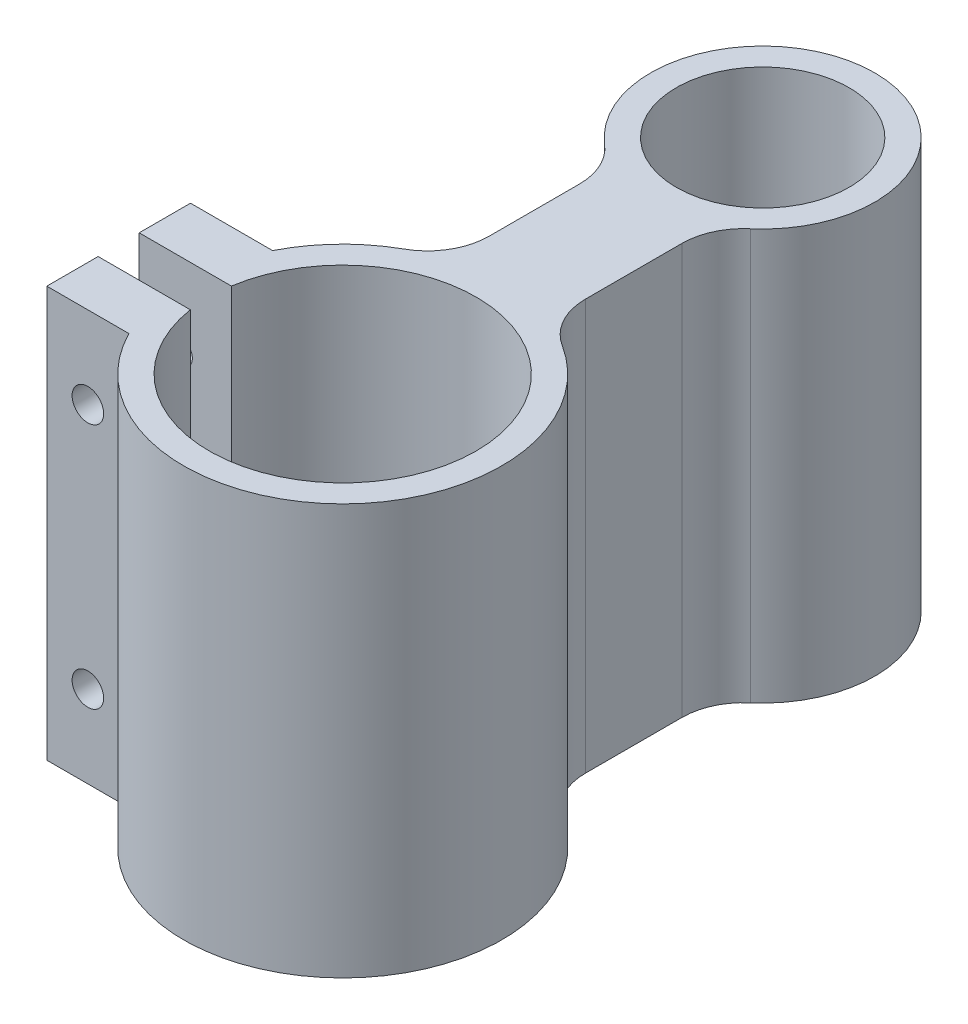
ISO-10303-21;
HEADER;
FILE_DESCRIPTION(('STEP AP214'),'2;1');
FILE_NAME('part.step','',(''),(''),'','','');
FILE_SCHEMA(('AUTOMOTIVE_DESIGN { 1 0 10303 214 1 1 1 1 }'));
ENDSEC;
DATA;
#1=APPLICATION_CONTEXT('core data for automotive mechanical design processes');
#2=APPLICATION_PROTOCOL_DEFINITION('international standard','automotive_design',2000,#1);
#3=PRODUCT_CONTEXT('',#1,'mechanical');
#4=PRODUCT('Part','Part','',(#3));
#5=PRODUCT_RELATED_PRODUCT_CATEGORY('part','',(#4));
#6=PRODUCT_DEFINITION_FORMATION('','',#4);
#7=PRODUCT_DEFINITION_CONTEXT('part definition',#1,'design');
#8=PRODUCT_DEFINITION('design','',#6,#7);
#9=PRODUCT_DEFINITION_SHAPE('','',#8);
#10=(LENGTH_UNIT() NAMED_UNIT(*) SI_UNIT(.MILLI.,.METRE.));
#11=(NAMED_UNIT(*) PLANE_ANGLE_UNIT() SI_UNIT($,.RADIAN.));
#12=(NAMED_UNIT(*) SI_UNIT($,.STERADIAN.) SOLID_ANGLE_UNIT());
#13=UNCERTAINTY_MEASURE_WITH_UNIT(LENGTH_MEASURE(1.E-05),#10,'distance_accuracy_value','');
#14=(GEOMETRIC_REPRESENTATION_CONTEXT(3) GLOBAL_UNCERTAINTY_ASSIGNED_CONTEXT((#13)) GLOBAL_UNIT_ASSIGNED_CONTEXT((#10,
#11,#12)) REPRESENTATION_CONTEXT('',''));
#15=CARTESIAN_POINT('',(0.,0.,0.));
#16=DIRECTION('',(0.,0.,1.));
#17=DIRECTION('',(1.,0.,0.));
#18=AXIS2_PLACEMENT_3D('',#15,#16,#17);
#19=CARTESIAN_POINT('',(0.787192232949083,50.8,-32.7963390410233));
#20=DIRECTION('',(0.,-1.,0.));
#21=DIRECTION('',(0.,0.,-1.));
#22=AXIS2_PLACEMENT_3D('',#19,#20,#21);
#23=CYLINDRICAL_SURFACE('',#22,10.6934);
#24=CARTESIAN_POINT('',(0.787192232949083,50.8,-32.7963390410233));
#25=DIRECTION('',(0.,1.,0.));
#26=DIRECTION('',(0.,0.,1.));
#27=AXIS2_PLACEMENT_3D('',#24,#25,#26);
#28=CIRCLE('',#27,10.6934);
#29=CARTESIAN_POINT('',(0.787192232949083,50.8,-22.1029390410233));
#30=VERTEX_POINT('',#29);
#31=EDGE_CURVE('E397',#30,#30,#28,.T.);
#32=ORIENTED_EDGE('',*,*,#31,.T.);
#33=EDGE_LOOP('',(#32));
#34=FACE_BOUND('',#33,.T.);
#35=CARTESIAN_POINT('',(0.787192232949083,0.,-32.7963390410233));
#36=DIRECTION('',(0.,1.,0.));
#37=DIRECTION('',(0.,0.,1.));
#38=AXIS2_PLACEMENT_3D('',#35,#36,#37);
#39=CIRCLE('',#38,10.6934);
#40=CARTESIAN_POINT('',(0.787192232949083,0.,-22.1029390410233));
#41=VERTEX_POINT('',#40);
#42=EDGE_CURVE('E308',#41,#41,#39,.T.);
#43=ORIENTED_EDGE('',*,*,#42,.F.);
#44=EDGE_LOOP('',(#43));
#45=FACE_BOUND('',#44,.T.);
#46=ADVANCED_FACE('F172',(#34,#45),#23,.F.);
#47=CARTESIAN_POINT('',(0.787192232949083,50.8,-32.7963390410233));
#48=DIRECTION('',(0.,-1.,0.));
#49=DIRECTION('',(0.,0.,-1.));
#50=AXIS2_PLACEMENT_3D('',#47,#48,#49);
#51=CYLINDRICAL_SURFACE('',#50,13.8684);
#52=CARTESIAN_POINT('',(0.787192232949083,50.8,-32.7963390410233));
#53=DIRECTION('',(0.,1.,0.));
#54=DIRECTION('',(0.,0.,1.));
#55=AXIS2_PLACEMENT_3D('',#52,#53,#54);
#56=CIRCLE('',#55,13.8684);
#57=CARTESIAN_POINT('',(9.80329152372923,50.8,-22.258669842439));
#58=VERTEX_POINT('',#57);
#59=CARTESIAN_POINT('',(-8.22890705783106,50.8,-22.258669842439));
#60=VERTEX_POINT('',#59);
#61=EDGE_CURVE('E358',#58,#60,#56,.T.);
#62=ORIENTED_EDGE('',*,*,#61,.F.);
#63=DIRECTION('',(0.,-1.,0.));
#64=VECTOR('',#63,1.);
#65=CARTESIAN_POINT('',(9.80329152372923,50.8,-22.258669842439));
#66=LINE('',#65,#64);
#67=CARTESIAN_POINT('',(9.80329152372923,0.,-22.258669842439));
#68=VERTEX_POINT('',#67);
#69=EDGE_CURVE('E365',#58,#68,#66,.T.);
#70=ORIENTED_EDGE('',*,*,#69,.T.);
#71=CARTESIAN_POINT('',(0.787192232949083,0.,-32.7963390410233));
#72=DIRECTION('',(0.,1.,0.));
#73=DIRECTION('',(0.,0.,1.));
#74=AXIS2_PLACEMENT_3D('',#71,#72,#73);
#75=CIRCLE('',#74,13.8684);
#76=CARTESIAN_POINT('',(-8.22890705783106,0.,-22.258669842439));
#77=VERTEX_POINT('',#76);
#78=EDGE_CURVE('E389',#68,#77,#75,.T.);
#79=ORIENTED_EDGE('',*,*,#78,.T.);
#80=DIRECTION('',(0.,-1.,0.));
#81=VECTOR('',#80,1.);
#82=CARTESIAN_POINT('',(-8.22890705783106,50.8,-22.258669842439));
#83=LINE('',#82,#81);
#84=EDGE_CURVE('E363',#77,#60,#83,.F.);
#85=ORIENTED_EDGE('',*,*,#84,.T.);
#86=EDGE_LOOP('',(#62,#70,#79,#85));
#87=FACE_BOUND('',#86,.T.);
#88=ADVANCED_FACE('F395',(#87),#51,.T.);
#89=CARTESIAN_POINT('',(0.,50.8,0.));
#90=DIRECTION('',(0.,1.,0.));
#91=DIRECTION('',(0.,0.,1.));
#92=AXIS2_PLACEMENT_3D('',#89,#90,#91);
#93=PLANE('',#92);
#94=ORIENTED_EDGE('',*,*,#31,.F.);
#95=EDGE_LOOP('',(#94));
#96=FACE_BOUND('',#95,.T.);
#97=DIRECTION('',(0.,0.,1.));
#98=VECTOR('',#97,1.);
#99=CARTESIAN_POINT('',(7.13719223294909,50.8,-20.46710473552));
#100=LINE('',#99,#98);
#101=CARTESIAN_POINT('',(7.13719223294909,50.8,-16.4687417113487));
#102=VERTEX_POINT('',#101);
#103=CARTESIAN_POINT('',(7.13719223294909,50.8,-4.53910448693543));
#104=VERTEX_POINT('',#103);
#105=EDGE_CURVE('E345',#102,#104,#100,.T.);
#106=ORIENTED_EDGE('',*,*,#105,.F.);
#107=CARTESIAN_POINT('',(14.7571922329491,50.8,-16.4687417113487));
#108=DIRECTION('',(0.,1.,0.));
#109=DIRECTION('',(0.,0.,1.));
#110=AXIS2_PLACEMENT_3D('',#107,#108,#109);
#111=CIRCLE('',#110,7.62);
#112=EDGE_CURVE('E380',#102,#58,#111,.F.);
#113=ORIENTED_EDGE('',*,*,#112,.T.);
#114=ORIENTED_EDGE('',*,*,#61,.T.);
#115=CARTESIAN_POINT('',(-13.1828077670509,50.8,-16.4687417113486));
#116=DIRECTION('',(0.,1.,0.));
#117=DIRECTION('',(0.,0.,1.));
#118=AXIS2_PLACEMENT_3D('',#115,#116,#117);
#119=CIRCLE('',#118,7.62);
#120=CARTESIAN_POINT('',(-5.56280776705091,50.8,-16.4687417113486));
#121=VERTEX_POINT('',#120);
#122=EDGE_CURVE('E12',#60,#121,#119,.F.);
#123=ORIENTED_EDGE('',*,*,#122,.T.);
#124=DIRECTION('',(0.,0.,1.));
#125=VECTOR('',#124,1.);
#126=CARTESIAN_POINT('',(-5.56280776705091,50.8,-20.46710473552));
#127=LINE('',#126,#125);
#128=CARTESIAN_POINT('',(-5.56280776705091,50.8,-5.30139566395274));
#129=VERTEX_POINT('',#128);
#130=EDGE_CURVE('E339',#121,#129,#127,.T.);
#131=ORIENTED_EDGE('',*,*,#130,.T.);
#132=CARTESIAN_POINT('',(-13.1828077670509,50.8,-5.30139566395274));
#133=DIRECTION('',(0.,1.,0.));
#134=DIRECTION('',(0.,0.,1.));
#135=AXIS2_PLACEMENT_3D('',#132,#133,#134);
#136=CIRCLE('',#135,7.62);
#137=CARTESIAN_POINT('',(-9.46274019856852,50.8,1.34882969207283));
#138=VERTEX_POINT('',#137);
#139=EDGE_CURVE('E292',#129,#138,#136,.F.);
#140=ORIENTED_EDGE('',*,*,#139,.T.);
#141=CARTESIAN_POINT('',(0.147434353344346,50.8,18.5285785284722));
#142=DIRECTION('',(0.,1.,0.));
#143=DIRECTION('',(0.,0.,1.));
#144=AXIS2_PLACEMENT_3D('',#141,#142,#143);
#145=CIRCLE('',#144,19.685);
#146=CARTESIAN_POINT('',(-17.4157978377986,50.8,9.63857852847224));
#147=VERTEX_POINT('',#146);
#148=EDGE_CURVE('E283',#138,#147,#145,.T.);
#149=ORIENTED_EDGE('',*,*,#148,.T.);
#150=DIRECTION('',(-1.,0.,0.));
#151=VECTOR('',#150,1.);
#152=CARTESIAN_POINT('',(-17.4157978377986,50.8,9.63857852847224));
#153=LINE('',#152,#151);
#154=CARTESIAN_POINT('',(-27.5757978377986,50.8,9.63857852847224));
#155=VERTEX_POINT('',#154);
#156=EDGE_CURVE('E289',#147,#155,#153,.T.);
#157=ORIENTED_EDGE('',*,*,#156,.T.);
#158=DIRECTION('',(0.,0.,-1.));
#159=VECTOR('',#158,1.);
#160=CARTESIAN_POINT('',(-27.5757978377986,50.8,15.9885785284722));
#161=LINE('',#160,#159);
#162=CARTESIAN_POINT('',(-27.5757978377986,50.8,15.9885785284722));
#163=VERTEX_POINT('',#162);
#164=EDGE_CURVE('E314',#163,#155,#161,.T.);
#165=ORIENTED_EDGE('',*,*,#164,.F.);
#166=DIRECTION('',(-1.,0.,0.));
#167=VECTOR('',#166,1.);
#168=CARTESIAN_POINT('',(0.,50.8,15.9885785284722));
#169=LINE('',#168,#167);
#170=CARTESIAN_POINT('',(-16.1660110215604,50.8,15.9885785284722));
#171=VERTEX_POINT('',#170);
#172=EDGE_CURVE('E296',#171,#163,#169,.T.);
#173=ORIENTED_EDGE('',*,*,#172,.F.);
#174=CARTESIAN_POINT('',(0.147434353344346,50.8,18.5285785284722));
#175=DIRECTION('',(0.,1.,0.));
#176=DIRECTION('',(0.,0.,1.));
#177=AXIS2_PLACEMENT_3D('',#174,#175,#176);
#178=CIRCLE('',#177,16.51);
#179=CARTESIAN_POINT('',(-16.1660110215604,50.8,21.0685785284722));
#180=VERTEX_POINT('',#179);
#181=EDGE_CURVE('E428',#180,#171,#178,.T.);
#182=ORIENTED_EDGE('',*,*,#181,.F.);
#183=DIRECTION('',(-1.,0.,0.));
#184=VECTOR('',#183,1.);
#185=CARTESIAN_POINT('',(0.,50.8,21.0685785284722));
#186=LINE('',#185,#184);
#187=CARTESIAN_POINT('',(-27.5757978377986,50.8,21.0685785284722));
#188=VERTEX_POINT('',#187);
#189=EDGE_CURVE('E442',#180,#188,#186,.T.);
#190=ORIENTED_EDGE('',*,*,#189,.T.);
#191=DIRECTION('',(0.,0.,1.));
#192=VECTOR('',#191,1.);
#193=CARTESIAN_POINT('',(-27.5757978377986,50.8,21.0685785284722));
#194=LINE('',#193,#192);
#195=CARTESIAN_POINT('',(-27.5757978377986,50.8,27.4185785284722));
#196=VERTEX_POINT('',#195);
#197=EDGE_CURVE('E332',#188,#196,#194,.T.);
#198=ORIENTED_EDGE('',*,*,#197,.T.);
#199=DIRECTION('',(-1.,0.,0.));
#200=VECTOR('',#199,1.);
#201=CARTESIAN_POINT('',(-17.4157978377986,50.8,27.4185785284722));
#202=LINE('',#201,#200);
#203=CARTESIAN_POINT('',(-17.4157978377986,50.8,27.4185785284722));
#204=VERTEX_POINT('',#203);
#205=EDGE_CURVE('E329',#204,#196,#202,.T.);
#206=ORIENTED_EDGE('',*,*,#205,.F.);
#207=CARTESIAN_POINT('',(10.6800504991059,50.8,1.89838844759694));
#208=VERTEX_POINT('',#207);
#209=EDGE_CURVE('E299',#204,#208,#145,.T.);
#210=ORIENTED_EDGE('',*,*,#209,.T.);
#211=CARTESIAN_POINT('',(14.7571922329491,50.8,-4.53910448693543));
#212=DIRECTION('',(0.,1.,0.));
#213=DIRECTION('',(0.,0.,1.));
#214=AXIS2_PLACEMENT_3D('',#211,#212,#213);
#215=CIRCLE('',#214,7.62);
#216=EDGE_CURVE('E376',#208,#104,#215,.F.);
#217=ORIENTED_EDGE('',*,*,#216,.T.);
#218=EDGE_LOOP('',(#106,#113,#114,#123,#131,#140,#149,#157,#165,#173,#182,#190,#198,#206,#210,#217));
#219=FACE_BOUND('',#218,.T.);
#220=ADVANCED_FACE('F286',(#96,#219),#93,.T.);
#221=CARTESIAN_POINT('',(0.,0.,0.));
#222=DIRECTION('',(0.,1.,0.));
#223=DIRECTION('',(0.,0.,1.));
#224=AXIS2_PLACEMENT_3D('',#221,#222,#223);
#225=PLANE('',#224);
#226=ORIENTED_EDGE('',*,*,#42,.T.);
#227=EDGE_LOOP('',(#226));
#228=FACE_BOUND('',#227,.T.);
#229=ORIENTED_EDGE('',*,*,#78,.F.);
#230=CARTESIAN_POINT('',(14.7571922329491,0.,-16.4687417113487));
#231=DIRECTION('',(0.,1.,0.));
#232=DIRECTION('',(0.,0.,1.));
#233=AXIS2_PLACEMENT_3D('',#230,#231,#232);
#234=CIRCLE('',#233,7.62);
#235=CARTESIAN_POINT('',(7.13719223294909,0.,-16.4687417113487));
#236=VERTEX_POINT('',#235);
#237=EDGE_CURVE('E378',#68,#236,#234,.T.);
#238=ORIENTED_EDGE('',*,*,#237,.T.);
#239=DIRECTION('',(0.,0.,1.));
#240=VECTOR('',#239,1.);
#241=CARTESIAN_POINT('',(7.13719223294909,0.,-20.46710473552));
#242=LINE('',#241,#240);
#243=CARTESIAN_POINT('',(7.13719223294909,0.,-4.53910448693543));
#244=VERTEX_POINT('',#243);
#245=EDGE_CURVE('E350',#236,#244,#242,.T.);
#246=ORIENTED_EDGE('',*,*,#245,.T.);
#247=CARTESIAN_POINT('',(14.7571922329491,0.,-4.53910448693543));
#248=DIRECTION('',(0.,1.,0.));
#249=DIRECTION('',(0.,0.,1.));
#250=AXIS2_PLACEMENT_3D('',#247,#248,#249);
#251=CIRCLE('',#250,7.62);
#252=CARTESIAN_POINT('',(10.6800504991059,0.,1.89838844759694));
#253=VERTEX_POINT('',#252);
#254=EDGE_CURVE('E374',#244,#253,#251,.T.);
#255=ORIENTED_EDGE('',*,*,#254,.T.);
#256=CARTESIAN_POINT('',(0.147434353344346,0.,18.5285785284722));
#257=DIRECTION('',(0.,1.,0.));
#258=DIRECTION('',(0.,0.,1.));
#259=AXIS2_PLACEMENT_3D('',#256,#257,#258);
#260=CIRCLE('',#259,19.685);
#261=CARTESIAN_POINT('',(-17.4157978377986,0.,27.4185785284722));
#262=VERTEX_POINT('',#261);
#263=EDGE_CURVE('E297',#262,#253,#260,.T.);
#264=ORIENTED_EDGE('',*,*,#263,.F.);
#265=DIRECTION('',(-1.,0.,0.));
#266=VECTOR('',#265,1.);
#267=CARTESIAN_POINT('',(-17.4157978377986,0.,27.4185785284722));
#268=LINE('',#267,#266);
#269=CARTESIAN_POINT('',(-27.5757978377986,0.,27.4185785284722));
#270=VERTEX_POINT('',#269);
#271=EDGE_CURVE('E336',#262,#270,#268,.T.);
#272=ORIENTED_EDGE('',*,*,#271,.T.);
#273=DIRECTION('',(0.,0.,1.));
#274=VECTOR('',#273,1.);
#275=CARTESIAN_POINT('',(-27.5757978377986,0.,21.0685785284722));
#276=LINE('',#275,#274);
#277=CARTESIAN_POINT('',(-27.5757978377986,0.,21.0685785284722));
#278=VERTEX_POINT('',#277);
#279=EDGE_CURVE('E333',#278,#270,#276,.T.);
#280=ORIENTED_EDGE('',*,*,#279,.F.);
#281=DIRECTION('',(-1.,0.,0.));
#282=VECTOR('',#281,1.);
#283=CARTESIAN_POINT('',(0.,0.,21.0685785284722));
#284=LINE('',#283,#282);
#285=CARTESIAN_POINT('',(-16.1660110215604,0.,21.0685785284722));
#286=VERTEX_POINT('',#285);
#287=EDGE_CURVE('E408',#286,#278,#284,.T.);
#288=ORIENTED_EDGE('',*,*,#287,.F.);
#289=CARTESIAN_POINT('',(0.147434353344346,0.,18.5285785284722));
#290=DIRECTION('',(0.,1.,0.));
#291=DIRECTION('',(0.,0.,1.));
#292=AXIS2_PLACEMENT_3D('',#289,#290,#291);
#293=CIRCLE('',#292,16.51);
#294=CARTESIAN_POINT('',(-16.1660110215604,0.,15.9885785284722));
#295=VERTEX_POINT('',#294);
#296=EDGE_CURVE('E404',#286,#295,#293,.T.);
#297=ORIENTED_EDGE('',*,*,#296,.T.);
#298=DIRECTION('',(-1.,0.,0.));
#299=VECTOR('',#298,1.);
#300=CARTESIAN_POINT('',(0.,0.,15.9885785284722));
#301=LINE('',#300,#299);
#302=CARTESIAN_POINT('',(-27.5757978377986,0.,15.9885785284722));
#303=VERTEX_POINT('',#302);
#304=EDGE_CURVE('E402',#295,#303,#301,.T.);
#305=ORIENTED_EDGE('',*,*,#304,.T.);
#306=DIRECTION('',(0.,0.,-1.));
#307=VECTOR('',#306,1.);
#308=CARTESIAN_POINT('',(-27.5757978377986,0.,15.9885785284722));
#309=LINE('',#308,#307);
#310=CARTESIAN_POINT('',(-27.5757978377986,0.,9.63857852847224));
#311=VERTEX_POINT('',#310);
#312=EDGE_CURVE('E315',#303,#311,#309,.T.);
#313=ORIENTED_EDGE('',*,*,#312,.T.);
#314=DIRECTION('',(-1.,0.,0.));
#315=VECTOR('',#314,1.);
#316=CARTESIAN_POINT('',(-17.4157978377986,0.,9.63857852847224));
#317=LINE('',#316,#315);
#318=CARTESIAN_POINT('',(-17.4157978377986,0.,9.63857852847224));
#319=VERTEX_POINT('',#318);
#320=EDGE_CURVE('E320',#319,#311,#317,.T.);
#321=ORIENTED_EDGE('',*,*,#320,.F.);
#322=CARTESIAN_POINT('',(-9.46274019856852,0.,1.34882969207283));
#323=VERTEX_POINT('',#322);
#324=EDGE_CURVE('E304',#323,#319,#260,.T.);
#325=ORIENTED_EDGE('',*,*,#324,.F.);
#326=CARTESIAN_POINT('',(-13.1828077670509,0.,-5.30139566395274));
#327=DIRECTION('',(0.,1.,0.));
#328=DIRECTION('',(0.,0.,1.));
#329=AXIS2_PLACEMENT_3D('',#326,#327,#328);
#330=CIRCLE('',#329,7.62);
#331=CARTESIAN_POINT('',(-5.56280776705091,0.,-5.30139566395274));
#332=VERTEX_POINT('',#331);
#333=EDGE_CURVE('E382',#323,#332,#330,.T.);
#334=ORIENTED_EDGE('',*,*,#333,.T.);
#335=DIRECTION('',(0.,0.,1.));
#336=VECTOR('',#335,1.);
#337=CARTESIAN_POINT('',(-5.56280776705091,0.,-20.46710473552));
#338=LINE('',#337,#336);
#339=CARTESIAN_POINT('',(-5.56280776705091,0.,-16.4687417113486));
#340=VERTEX_POINT('',#339);
#341=EDGE_CURVE('E348',#340,#332,#338,.T.);
#342=ORIENTED_EDGE('',*,*,#341,.F.);
#343=CARTESIAN_POINT('',(-13.1828077670509,0.,-16.4687417113486));
#344=DIRECTION('',(0.,1.,0.));
#345=DIRECTION('',(0.,0.,1.));
#346=AXIS2_PLACEMENT_3D('',#343,#344,#345);
#347=CIRCLE('',#346,7.62);
#348=EDGE_CURVE('E180',#340,#77,#347,.T.);
#349=ORIENTED_EDGE('',*,*,#348,.T.);
#350=EDGE_LOOP('',(#229,#238,#246,#255,#264,#272,#280,#288,#297,#305,#313,#321,#325,#334,#342,#349));
#351=FACE_BOUND('',#350,.T.);
#352=ADVANCED_FACE('F388',(#228,#351),#225,.F.);
#353=CARTESIAN_POINT('',(-27.5757978377986,50.8,15.9885785284722));
#354=DIRECTION('',(-1.,0.,0.));
#355=DIRECTION('',(0.,0.,1.));
#356=AXIS2_PLACEMENT_3D('',#353,#354,#355);
#357=PLANE('',#356);
#358=ORIENTED_EDGE('',*,*,#312,.F.);
#359=DIRECTION('',(0.,-1.,0.));
#360=VECTOR('',#359,1.);
#361=CARTESIAN_POINT('',(-27.5757978377986,50.8,15.9885785284722));
#362=LINE('',#361,#360);
#363=EDGE_CURVE('E317',#163,#303,#362,.T.);
#364=ORIENTED_EDGE('',*,*,#363,.F.);
#365=ORIENTED_EDGE('',*,*,#164,.T.);
#366=DIRECTION('',(0.,-1.,0.));
#367=VECTOR('',#366,1.);
#368=CARTESIAN_POINT('',(-27.5757978377986,50.8,9.63857852847224));
#369=LINE('',#368,#367);
#370=EDGE_CURVE('E312',#155,#311,#369,.T.);
#371=ORIENTED_EDGE('',*,*,#370,.T.);
#372=EDGE_LOOP('',(#358,#364,#365,#371));
#373=FACE_BOUND('',#372,.T.);
#374=ADVANCED_FACE('F481',(#373),#357,.T.);
#375=CARTESIAN_POINT('',(-27.5757978377986,50.8,21.0685785284722));
#376=DIRECTION('',(1.,0.,0.));
#377=DIRECTION('',(0.,0.,-1.));
#378=AXIS2_PLACEMENT_3D('',#375,#376,#377);
#379=PLANE('',#378);
#380=ORIENTED_EDGE('',*,*,#279,.T.);
#381=DIRECTION('',(0.,-1.,0.));
#382=VECTOR('',#381,1.);
#383=CARTESIAN_POINT('',(-27.5757978377986,50.8,27.4185785284722));
#384=LINE('',#383,#382);
#385=EDGE_CURVE('E335',#196,#270,#384,.T.);
#386=ORIENTED_EDGE('',*,*,#385,.F.);
#387=ORIENTED_EDGE('',*,*,#197,.F.);
#388=DIRECTION('',(0.,-1.,0.));
#389=VECTOR('',#388,1.);
#390=CARTESIAN_POINT('',(-27.5757978377986,50.8,21.0685785284722));
#391=LINE('',#390,#389);
#392=EDGE_CURVE('E324',#188,#278,#391,.T.);
#393=ORIENTED_EDGE('',*,*,#392,.T.);
#394=EDGE_LOOP('',(#380,#386,#387,#393));
#395=FACE_BOUND('',#394,.T.);
#396=ADVANCED_FACE('F438',(#395),#379,.F.);
#397=CARTESIAN_POINT('',(-17.4157978377986,50.8,27.4185785284722));
#398=DIRECTION('',(0.,0.,1.));
#399=DIRECTION('',(1.,0.,0.));
#400=AXIS2_PLACEMENT_3D('',#397,#398,#399);
#401=PLANE('',#400);
#402=CARTESIAN_POINT('',(-22.4957978377986,40.64,27.4185785284722));
#403=DIRECTION('',(0.,0.,1.));
#404=DIRECTION('',(1.,0.,0.));
#405=AXIS2_PLACEMENT_3D('',#402,#403,#404);
#406=CIRCLE('',#405,1.95);
#407=CARTESIAN_POINT('',(-20.5457978377986,40.64,27.4185785284722));
#408=VERTEX_POINT('',#407);
#409=EDGE_CURVE('E353',#408,#408,#406,.T.);
#410=ORIENTED_EDGE('',*,*,#409,.F.);
#411=EDGE_LOOP('',(#410));
#412=FACE_BOUND('',#411,.T.);
#413=CARTESIAN_POINT('',(-22.4957978377986,10.16,27.4185785284722));
#414=DIRECTION('',(0.,0.,1.));
#415=DIRECTION('',(1.,0.,0.));
#416=AXIS2_PLACEMENT_3D('',#413,#414,#415);
#417=CIRCLE('',#416,1.95);
#418=CARTESIAN_POINT('',(-20.5457978377986,10.16,27.4185785284722));
#419=VERTEX_POINT('',#418);
#420=EDGE_CURVE('E453',#419,#419,#417,.T.);
#421=ORIENTED_EDGE('',*,*,#420,.F.);
#422=EDGE_LOOP('',(#421));
#423=FACE_BOUND('',#422,.T.);
#424=ORIENTED_EDGE('',*,*,#271,.F.);
#425=DIRECTION('',(0.,-1.,0.));
#426=VECTOR('',#425,1.);
#427=CARTESIAN_POINT('',(-17.4157978377986,50.8,27.4185785284722));
#428=LINE('',#427,#426);
#429=EDGE_CURVE('E419',#204,#262,#428,.T.);
#430=ORIENTED_EDGE('',*,*,#429,.F.);
#431=ORIENTED_EDGE('',*,*,#205,.T.);
#432=ORIENTED_EDGE('',*,*,#385,.T.);
#433=EDGE_LOOP('',(#424,#430,#431,#432));
#434=FACE_BOUND('',#433,.T.);
#435=ADVANCED_FACE('F479',(#412,#423,#434),#401,.T.);
#436=CARTESIAN_POINT('',(-17.4157978377986,50.8,9.63857852847224));
#437=DIRECTION('',(0.,0.,1.));
#438=DIRECTION('',(1.,0.,0.));
#439=AXIS2_PLACEMENT_3D('',#436,#437,#438);
#440=PLANE('',#439);
#441=CARTESIAN_POINT('',(-22.4957978377986,10.16,9.63857852847224));
#442=DIRECTION('',(0.,0.,-1.));
#443=DIRECTION('',(-1.,0.,0.));
#444=AXIS2_PLACEMENT_3D('',#441,#442,#443);
#445=CIRCLE('',#444,1.5);
#446=CARTESIAN_POINT('',(-23.9957978377986,10.16,9.63857852847224));
#447=VERTEX_POINT('',#446);
#448=EDGE_CURVE('E460',#447,#447,#445,.T.);
#449=ORIENTED_EDGE('',*,*,#448,.F.);
#450=EDGE_LOOP('',(#449));
#451=FACE_BOUND('',#450,.T.);
#452=CARTESIAN_POINT('',(-22.4957978377986,40.64,9.63857852847224));
#453=DIRECTION('',(0.,0.,-1.));
#454=DIRECTION('',(-1.,0.,0.));
#455=AXIS2_PLACEMENT_3D('',#452,#453,#454);
#456=CIRCLE('',#455,1.5);
#457=CARTESIAN_POINT('',(-23.9957978377986,40.64,9.63857852847224));
#458=VERTEX_POINT('',#457);
#459=EDGE_CURVE('E463',#458,#458,#456,.T.);
#460=ORIENTED_EDGE('',*,*,#459,.F.);
#461=EDGE_LOOP('',(#460));
#462=FACE_BOUND('',#461,.T.);
#463=ORIENTED_EDGE('',*,*,#320,.T.);
#464=ORIENTED_EDGE('',*,*,#370,.F.);
#465=ORIENTED_EDGE('',*,*,#156,.F.);
#466=DIRECTION('',(0.,-1.,0.));
#467=VECTOR('',#466,1.);
#468=CARTESIAN_POINT('',(-17.4157978377986,50.8,9.63857852847224));
#469=LINE('',#468,#467);
#470=EDGE_CURVE('E301',#147,#319,#469,.T.);
#471=ORIENTED_EDGE('',*,*,#470,.T.);
#472=EDGE_LOOP('',(#463,#464,#465,#471));
#473=FACE_BOUND('',#472,.T.);
#474=ADVANCED_FACE('F311',(#451,#462,#473),#440,.F.);
#475=CARTESIAN_POINT('',(0.,50.8,15.9885785284722));
#476=DIRECTION('',(0.,0.,1.));
#477=DIRECTION('',(1.,0.,0.));
#478=AXIS2_PLACEMENT_3D('',#475,#476,#477);
#479=PLANE('',#478);
#480=CARTESIAN_POINT('',(-22.4957978377986,10.16,15.9885785284722));
#481=DIRECTION('',(0.,0.,1.));
#482=DIRECTION('',(1.,0.,0.));
#483=AXIS2_PLACEMENT_3D('',#480,#481,#482);
#484=CIRCLE('',#483,1.5);
#485=CARTESIAN_POINT('',(-20.9957978377986,10.16,15.9885785284722));
#486=VERTEX_POINT('',#485);
#487=EDGE_CURVE('E469',#486,#486,#484,.F.);
#488=ORIENTED_EDGE('',*,*,#487,.T.);
#489=EDGE_LOOP('',(#488));
#490=FACE_BOUND('',#489,.T.);
#491=CARTESIAN_POINT('',(-22.4957978377986,40.64,15.9885785284722));
#492=DIRECTION('',(0.,0.,1.));
#493=DIRECTION('',(1.,0.,0.));
#494=AXIS2_PLACEMENT_3D('',#491,#492,#493);
#495=CIRCLE('',#494,1.5);
#496=CARTESIAN_POINT('',(-20.9957978377986,40.64,15.9885785284722));
#497=VERTEX_POINT('',#496);
#498=EDGE_CURVE('E466',#497,#497,#495,.F.);
#499=ORIENTED_EDGE('',*,*,#498,.T.);
#500=EDGE_LOOP('',(#499));
#501=FACE_BOUND('',#500,.T.);
#502=ORIENTED_EDGE('',*,*,#304,.F.);
#503=DIRECTION('',(0.,-1.,0.));
#504=VECTOR('',#503,1.);
#505=CARTESIAN_POINT('',(-16.1660110215604,50.8,15.9885785284722));
#506=LINE('',#505,#504);
#507=EDGE_CURVE('E309',#171,#295,#506,.T.);
#508=ORIENTED_EDGE('',*,*,#507,.F.);
#509=ORIENTED_EDGE('',*,*,#172,.T.);
#510=ORIENTED_EDGE('',*,*,#363,.T.);
#511=EDGE_LOOP('',(#502,#508,#509,#510));
#512=FACE_BOUND('',#511,.T.);
#513=ADVANCED_FACE('F431',(#490,#501,#512),#479,.T.);
#514=CARTESIAN_POINT('',(0.147434353344346,50.8,18.5285785284722));
#515=DIRECTION('',(0.,-1.,0.));
#516=DIRECTION('',(0.,0.,-1.));
#517=AXIS2_PLACEMENT_3D('',#514,#515,#516);
#518=CYLINDRICAL_SURFACE('',#517,16.51);
#519=ORIENTED_EDGE('',*,*,#296,.F.);
#520=DIRECTION('',(0.,-1.,0.));
#521=VECTOR('',#520,1.);
#522=CARTESIAN_POINT('',(-16.1660110215604,50.8,21.0685785284722));
#523=LINE('',#522,#521);
#524=EDGE_CURVE('E421',#180,#286,#523,.T.);
#525=ORIENTED_EDGE('',*,*,#524,.F.);
#526=ORIENTED_EDGE('',*,*,#181,.T.);
#527=ORIENTED_EDGE('',*,*,#507,.T.);
#528=EDGE_LOOP('',(#519,#525,#526,#527));
#529=FACE_BOUND('',#528,.T.);
#530=ADVANCED_FACE('F426',(#529),#518,.F.);
#531=CARTESIAN_POINT('',(0.,50.8,21.0685785284722));
#532=DIRECTION('',(0.,0.,1.));
#533=DIRECTION('',(1.,0.,0.));
#534=AXIS2_PLACEMENT_3D('',#531,#532,#533);
#535=PLANE('',#534);
#536=CARTESIAN_POINT('',(-22.4957978377986,40.64,21.0685785284722));
#537=DIRECTION('',(0.,0.,-1.));
#538=DIRECTION('',(-1.,0.,0.));
#539=AXIS2_PLACEMENT_3D('',#536,#537,#538);
#540=CIRCLE('',#539,1.95);
#541=CARTESIAN_POINT('',(-24.4457978377986,40.64,21.0685785284722));
#542=VERTEX_POINT('',#541);
#543=EDGE_CURVE('E456',#542,#542,#540,.T.);
#544=ORIENTED_EDGE('',*,*,#543,.F.);
#545=EDGE_LOOP('',(#544));
#546=FACE_BOUND('',#545,.T.);
#547=CARTESIAN_POINT('',(-22.4957978377986,10.16,21.0685785284722));
#548=DIRECTION('',(0.,0.,-1.));
#549=DIRECTION('',(1.,0.,0.));
#550=AXIS2_PLACEMENT_3D('',#547,#548,#549);
#551=CIRCLE('',#550,1.95);
#552=CARTESIAN_POINT('',(-20.5457978377986,10.16,21.0685785284722));
#553=VERTEX_POINT('',#552);
#554=EDGE_CURVE('E457',#553,#553,#551,.T.);
#555=ORIENTED_EDGE('',*,*,#554,.F.);
#556=EDGE_LOOP('',(#555));
#557=FACE_BOUND('',#556,.T.);
#558=ORIENTED_EDGE('',*,*,#287,.T.);
#559=ORIENTED_EDGE('',*,*,#392,.F.);
#560=ORIENTED_EDGE('',*,*,#189,.F.);
#561=ORIENTED_EDGE('',*,*,#524,.T.);
#562=EDGE_LOOP('',(#558,#559,#560,#561));
#563=FACE_BOUND('',#562,.T.);
#564=ADVANCED_FACE('F441',(#546,#557,#563),#535,.F.);
#565=CARTESIAN_POINT('',(0.147434353344346,50.8,18.5285785284722));
#566=DIRECTION('',(0.,-1.,0.));
#567=DIRECTION('',(0.,0.,-1.));
#568=AXIS2_PLACEMENT_3D('',#565,#566,#567);
#569=CYLINDRICAL_SURFACE('',#568,19.685);
#570=ORIENTED_EDGE('',*,*,#263,.T.);
#571=DIRECTION('',(0.,-1.,0.));
#572=VECTOR('',#571,1.);
#573=CARTESIAN_POINT('',(10.6800504991059,50.8,1.89838844759694));
#574=LINE('',#573,#572);
#575=EDGE_CURVE('E361',#253,#208,#574,.F.);
#576=ORIENTED_EDGE('',*,*,#575,.T.);
#577=ORIENTED_EDGE('',*,*,#209,.F.);
#578=ORIENTED_EDGE('',*,*,#429,.T.);
#579=EDGE_LOOP('',(#570,#576,#577,#578));
#580=FACE_BOUND('',#579,.T.);
#581=ADVANCED_FACE('F501',(#580),#569,.T.);
#582=ORIENTED_EDGE('',*,*,#148,.F.);
#583=DIRECTION('',(0.,-1.,0.));
#584=VECTOR('',#583,1.);
#585=CARTESIAN_POINT('',(-9.46274019856852,50.8,1.34882969207283));
#586=LINE('',#585,#584);
#587=EDGE_CURVE('E368',#138,#323,#586,.T.);
#588=ORIENTED_EDGE('',*,*,#587,.T.);
#589=ORIENTED_EDGE('',*,*,#324,.T.);
#590=ORIENTED_EDGE('',*,*,#470,.F.);
#591=EDGE_LOOP('',(#582,#588,#589,#590));
#592=FACE_BOUND('',#591,.T.);
#593=ADVANCED_FACE('F302',(#592),#569,.T.);
#594=CARTESIAN_POINT('',(7.13719223294909,50.8,-20.46710473552));
#595=DIRECTION('',(1.,0.,0.));
#596=DIRECTION('',(0.,0.,-1.));
#597=AXIS2_PLACEMENT_3D('',#594,#595,#596);
#598=PLANE('',#597);
#599=ORIENTED_EDGE('',*,*,#105,.T.);
#600=DIRECTION('',(0.,-1.,0.));
#601=VECTOR('',#600,1.);
#602=CARTESIAN_POINT('',(7.13719223294909,50.8,-4.53910448693543));
#603=LINE('',#602,#601);
#604=EDGE_CURVE('E357',#104,#244,#603,.T.);
#605=ORIENTED_EDGE('',*,*,#604,.T.);
#606=ORIENTED_EDGE('',*,*,#245,.F.);
#607=DIRECTION('',(0.,-1.,0.));
#608=VECTOR('',#607,1.);
#609=CARTESIAN_POINT('',(7.13719223294909,50.8,-16.4687417113487));
#610=LINE('',#609,#608);
#611=EDGE_CURVE('E355',#236,#102,#610,.F.);
#612=ORIENTED_EDGE('',*,*,#611,.T.);
#613=EDGE_LOOP('',(#599,#605,#606,#612));
#614=FACE_BOUND('',#613,.T.);
#615=ADVANCED_FACE('F500',(#614),#598,.T.);
#616=CARTESIAN_POINT('',(-5.56280776705091,50.8,-20.46710473552));
#617=DIRECTION('',(1.,0.,0.));
#618=DIRECTION('',(0.,0.,-1.));
#619=AXIS2_PLACEMENT_3D('',#616,#617,#618);
#620=PLANE('',#619);
#621=ORIENTED_EDGE('',*,*,#341,.T.);
#622=DIRECTION('',(0.,1.,0.));
#623=VECTOR('',#622,1.);
#624=CARTESIAN_POINT('',(-5.56280776705091,50.8,-5.30139566395274));
#625=LINE('',#624,#623);
#626=EDGE_CURVE('E187',#332,#129,#625,.T.);
#627=ORIENTED_EDGE('',*,*,#626,.T.);
#628=ORIENTED_EDGE('',*,*,#130,.F.);
#629=DIRECTION('',(0.,1.,0.));
#630=VECTOR('',#629,1.);
#631=CARTESIAN_POINT('',(-5.56280776705091,0.,-16.4687417113486));
#632=LINE('',#631,#630);
#633=EDGE_CURVE('E370',#121,#340,#632,.F.);
#634=ORIENTED_EDGE('',*,*,#633,.T.);
#635=EDGE_LOOP('',(#621,#627,#628,#634));
#636=FACE_BOUND('',#635,.T.);
#637=ADVANCED_FACE('F399',(#636),#620,.F.);
#638=CARTESIAN_POINT('',(14.7571922329491,50.8,-4.53910448693543));
#639=DIRECTION('',(0.,-1.,0.));
#640=DIRECTION('',(0.,0.,-1.));
#641=AXIS2_PLACEMENT_3D('',#638,#639,#640);
#642=CYLINDRICAL_SURFACE('',#641,7.62);
#643=ORIENTED_EDGE('',*,*,#216,.F.);
#644=ORIENTED_EDGE('',*,*,#575,.F.);
#645=ORIENTED_EDGE('',*,*,#254,.F.);
#646=ORIENTED_EDGE('',*,*,#604,.F.);
#647=EDGE_LOOP('',(#643,#644,#645,#646));
#648=FACE_BOUND('',#647,.T.);
#649=ADVANCED_FACE('F529',(#648),#642,.F.);
#650=CARTESIAN_POINT('',(14.7571922329491,50.8,-16.4687417113487));
#651=DIRECTION('',(0.,-1.,0.));
#652=DIRECTION('',(0.,0.,-1.));
#653=AXIS2_PLACEMENT_3D('',#650,#651,#652);
#654=CYLINDRICAL_SURFACE('',#653,7.62);
#655=ORIENTED_EDGE('',*,*,#112,.F.);
#656=ORIENTED_EDGE('',*,*,#611,.F.);
#657=ORIENTED_EDGE('',*,*,#237,.F.);
#658=ORIENTED_EDGE('',*,*,#69,.F.);
#659=EDGE_LOOP('',(#655,#656,#657,#658));
#660=FACE_BOUND('',#659,.T.);
#661=ADVANCED_FACE('F533',(#660),#654,.F.);
#662=CARTESIAN_POINT('',(-13.1828077670509,50.8,-5.30139566395274));
#663=DIRECTION('',(0.,-1.,0.));
#664=DIRECTION('',(0.,0.,-1.));
#665=AXIS2_PLACEMENT_3D('',#662,#663,#664);
#666=CYLINDRICAL_SURFACE('',#665,7.62);
#667=ORIENTED_EDGE('',*,*,#139,.F.);
#668=ORIENTED_EDGE('',*,*,#626,.F.);
#669=ORIENTED_EDGE('',*,*,#333,.F.);
#670=ORIENTED_EDGE('',*,*,#587,.F.);
#671=EDGE_LOOP('',(#667,#668,#669,#670));
#672=FACE_BOUND('',#671,.T.);
#673=ADVANCED_FACE('F401',(#672),#666,.F.);
#674=CARTESIAN_POINT('',(-13.1828077670509,50.8,-16.4687417113486));
#675=DIRECTION('',(0.,-1.,0.));
#676=DIRECTION('',(0.,0.,-1.));
#677=AXIS2_PLACEMENT_3D('',#674,#675,#676);
#678=CYLINDRICAL_SURFACE('',#677,7.62);
#679=ORIENTED_EDGE('',*,*,#122,.F.);
#680=ORIENTED_EDGE('',*,*,#84,.F.);
#681=ORIENTED_EDGE('',*,*,#348,.F.);
#682=ORIENTED_EDGE('',*,*,#633,.F.);
#683=EDGE_LOOP('',(#679,#680,#681,#682));
#684=FACE_BOUND('',#683,.T.);
#685=ADVANCED_FACE('F174',(#684),#678,.F.);
#686=CARTESIAN_POINT('',(-22.4957978377986,10.16,38.2135785284722));
#687=DIRECTION('',(0.,0.,-1.));
#688=DIRECTION('',(-1.,0.,0.));
#689=AXIS2_PLACEMENT_3D('',#686,#687,#688);
#690=CYLINDRICAL_SURFACE('',#689,1.95);
#691=ORIENTED_EDGE('',*,*,#420,.T.);
#692=EDGE_LOOP('',(#691));
#693=FACE_BOUND('',#692,.T.);
#694=ORIENTED_EDGE('',*,*,#554,.T.);
#695=EDGE_LOOP('',(#694));
#696=FACE_BOUND('',#695,.T.);
#697=ADVANCED_FACE('F495',(#693,#696),#690,.F.);
#698=CARTESIAN_POINT('',(-22.4957978377986,40.64,38.2135785284722));
#699=DIRECTION('',(0.,0.,-1.));
#700=DIRECTION('',(-1.,0.,0.));
#701=AXIS2_PLACEMENT_3D('',#698,#699,#700);
#702=CYLINDRICAL_SURFACE('',#701,1.95);
#703=ORIENTED_EDGE('',*,*,#409,.T.);
#704=EDGE_LOOP('',(#703));
#705=FACE_BOUND('',#704,.T.);
#706=ORIENTED_EDGE('',*,*,#543,.T.);
#707=EDGE_LOOP('',(#706));
#708=FACE_BOUND('',#707,.T.);
#709=ADVANCED_FACE('F486',(#705,#708),#702,.F.);
#710=CARTESIAN_POINT('',(-22.4957978377986,40.64,38.2145785284723));
#711=DIRECTION('',(0.,0.,-1.));
#712=DIRECTION('',(-1.,0.,0.));
#713=AXIS2_PLACEMENT_3D('',#710,#711,#712);
#714=CYLINDRICAL_SURFACE('',#713,1.5);
#715=ORIENTED_EDGE('',*,*,#498,.F.);
#716=EDGE_LOOP('',(#715));
#717=FACE_BOUND('',#716,.T.);
#718=ORIENTED_EDGE('',*,*,#459,.T.);
#719=EDGE_LOOP('',(#718));
#720=FACE_BOUND('',#719,.T.);
#721=ADVANCED_FACE('F484',(#717,#720),#714,.F.);
#722=CARTESIAN_POINT('',(-22.4957978377986,10.16,38.2145785284723));
#723=DIRECTION('',(0.,0.,-1.));
#724=DIRECTION('',(-1.,0.,0.));
#725=AXIS2_PLACEMENT_3D('',#722,#723,#724);
#726=CYLINDRICAL_SURFACE('',#725,1.5);
#727=ORIENTED_EDGE('',*,*,#487,.F.);
#728=EDGE_LOOP('',(#727));
#729=FACE_BOUND('',#728,.T.);
#730=ORIENTED_EDGE('',*,*,#448,.T.);
#731=EDGE_LOOP('',(#730));
#732=FACE_BOUND('',#731,.T.);
#733=ADVANCED_FACE('F475',(#729,#732),#726,.F.);
#734=CLOSED_SHELL('',(#46,#88,#220,#352,#374,#396,#435,#474,#513,#530,#564,#581,#593,#615,#637,
#649,#661,#673,#685,#697,#709,#721,#733));
#735=MANIFOLD_SOLID_BREP('B2',#734);
#736=ADVANCED_BREP_SHAPE_REPRESENTATION('',(#18,#735),#14);
#737=SHAPE_DEFINITION_REPRESENTATION(#9,#736);
ENDSEC;
END-ISO-10303-21;
